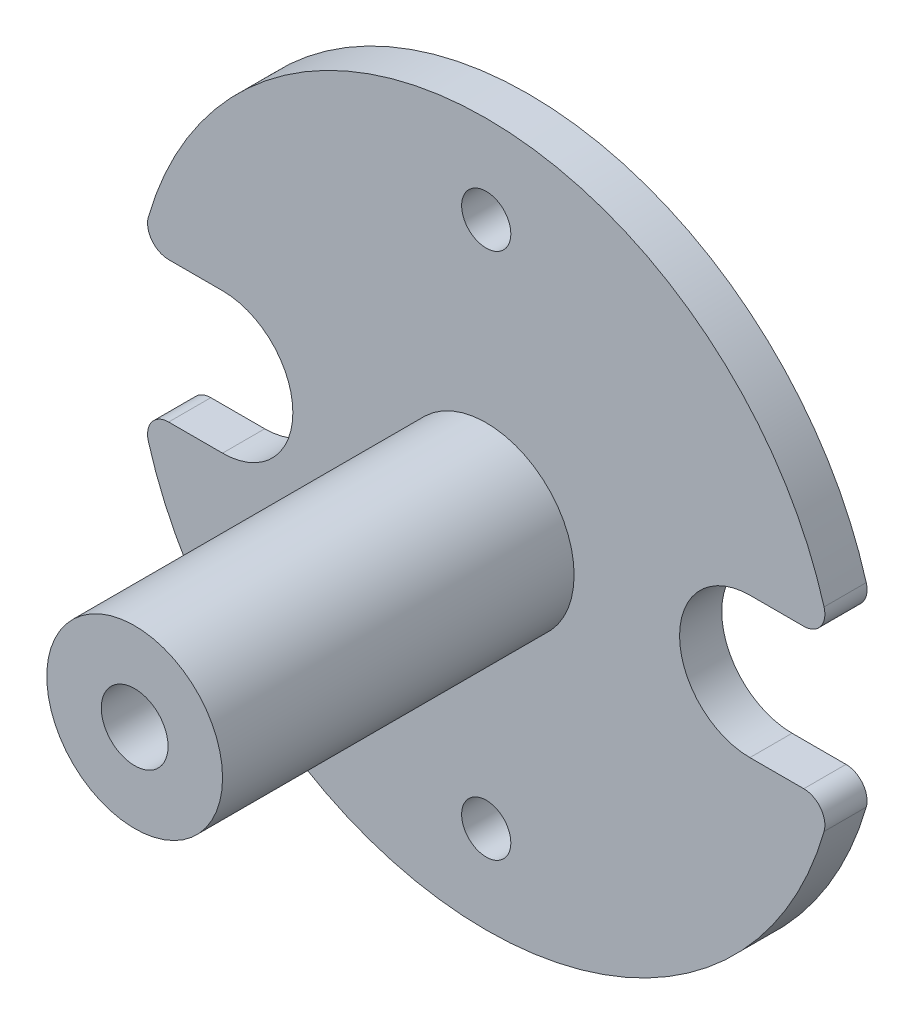
ISO-10303-21;
HEADER;
FILE_DESCRIPTION(('STEP AP214'),'2;1');
FILE_NAME('part.step','',(''),(''),'','','');
FILE_SCHEMA(('AUTOMOTIVE_DESIGN { 1 0 10303 214 1 1 1 1 }'));
ENDSEC;
DATA;
#1=APPLICATION_CONTEXT('core data for automotive mechanical design processes');
#2=APPLICATION_PROTOCOL_DEFINITION('international standard','automotive_design',2000,#1);
#3=PRODUCT_CONTEXT('',#1,'mechanical');
#4=PRODUCT('Part','Part','',(#3));
#5=PRODUCT_RELATED_PRODUCT_CATEGORY('part','',(#4));
#6=PRODUCT_DEFINITION_FORMATION('','',#4);
#7=PRODUCT_DEFINITION_CONTEXT('part definition',#1,'design');
#8=PRODUCT_DEFINITION('design','',#6,#7);
#9=PRODUCT_DEFINITION_SHAPE('','',#8);
#10=(LENGTH_UNIT() NAMED_UNIT(*) SI_UNIT(.MILLI.,.METRE.));
#11=(NAMED_UNIT(*) PLANE_ANGLE_UNIT() SI_UNIT($,.RADIAN.));
#12=(NAMED_UNIT(*) SI_UNIT($,.STERADIAN.) SOLID_ANGLE_UNIT());
#13=UNCERTAINTY_MEASURE_WITH_UNIT(LENGTH_MEASURE(1.E-05),#10,'distance_accuracy_value','');
#14=(GEOMETRIC_REPRESENTATION_CONTEXT(3) GLOBAL_UNCERTAINTY_ASSIGNED_CONTEXT((#13)) GLOBAL_UNIT_ASSIGNED_CONTEXT((#10,
#11,#12)) REPRESENTATION_CONTEXT('',''));
#15=CARTESIAN_POINT('',(0.,0.,0.));
#16=DIRECTION('',(0.,0.,1.));
#17=DIRECTION('',(1.,0.,0.));
#18=AXIS2_PLACEMENT_3D('',#15,#16,#17);
#19=CARTESIAN_POINT('',(-22.6983636363636,0.,-33.5049090909091));
#20=DIRECTION('',(0.,0.,-1.));
#21=DIRECTION('',(-1.,0.,0.));
#22=AXIS2_PLACEMENT_3D('',#19,#20,#21);
#23=PLANE('',#22);
#24=CARTESIAN_POINT('',(-22.6983636363636,-19.05,-33.5049090909091));
#25=DIRECTION('',(0.,0.,-1.));
#26=DIRECTION('',(-1.,0.,0.));
#27=AXIS2_PLACEMENT_3D('',#24,#25,#26);
#28=CIRCLE('',#27,1.778);
#29=CARTESIAN_POINT('',(-24.4763636363636,-19.05,-33.5049090909091));
#30=VERTEX_POINT('',#29);
#31=EDGE_CURVE('E171',#30,#30,#28,.T.);
#32=ORIENTED_EDGE('',*,*,#31,.F.);
#33=EDGE_LOOP('',(#32));
#34=FACE_BOUND('',#33,.T.);
#35=CARTESIAN_POINT('',(-22.6983636363636,19.05,-33.5049090909091));
#36=DIRECTION('',(0.,0.,-1.));
#37=DIRECTION('',(-1.,0.,0.));
#38=AXIS2_PLACEMENT_3D('',#35,#36,#37);
#39=CIRCLE('',#38,1.778);
#40=CARTESIAN_POINT('',(-24.4763636363636,19.05,-33.5049090909091));
#41=VERTEX_POINT('',#40);
#42=EDGE_CURVE('E188',#41,#41,#39,.T.);
#43=ORIENTED_EDGE('',*,*,#42,.F.);
#44=EDGE_LOOP('',(#43));
#45=FACE_BOUND('',#44,.T.);
#46=CARTESIAN_POINT('',(-22.6983636363636,0.,-33.5049090909091));
#47=DIRECTION('',(0.,0.,1.));
#48=DIRECTION('',(1.,0.,0.));
#49=AXIS2_PLACEMENT_3D('',#46,#47,#48);
#50=CIRCLE('',#49,25.4);
#51=CARTESIAN_POINT('',(1.71069003871374,7.0255319148938,-33.5049090909091));
#52=VERTEX_POINT('',#51);
#53=CARTESIAN_POINT('',(-47.1074173114411,7.02553191489362,-33.5049090909091));
#54=VERTEX_POINT('',#53);
#55=EDGE_CURVE('E209',#52,#54,#50,.T.);
#56=ORIENTED_EDGE('',*,*,#55,.F.);
#57=CARTESIAN_POINT('',(0.246146818209104,6.60400000000017,-33.5049090909091));
#58=DIRECTION('',(0.,0.,-1.));
#59=DIRECTION('',(-1.,0.,0.));
#60=AXIS2_PLACEMENT_3D('',#57,#58,#59);
#61=CIRCLE('',#60,1.524);
#62=CARTESIAN_POINT('',(0.246146818209114,5.08000000000017,-33.5049090909091));
#63=VERTEX_POINT('',#62);
#64=EDGE_CURVE('E249',#52,#63,#61,.T.);
#65=ORIENTED_EDGE('',*,*,#64,.T.);
#66=DIRECTION('',(1.,0.,0.));
#67=VECTOR('',#66,1.);
#68=CARTESIAN_POINT('',(-3.64836363636366,5.08000000000014,-33.5049090909091));
#69=LINE('',#68,#67);
#70=CARTESIAN_POINT('',(-3.64836363636367,5.08000000000014,-33.5049090909091));
#71=VERTEX_POINT('',#70);
#72=EDGE_CURVE('E178',#71,#63,#69,.T.);
#73=ORIENTED_EDGE('',*,*,#72,.F.);
#74=CARTESIAN_POINT('',(-3.64836363636363,1.37691343314675E-13,-33.5049090909091));
#75=DIRECTION('',(0.,0.,-1.));
#76=DIRECTION('',(-1.,0.,0.));
#77=AXIS2_PLACEMENT_3D('',#74,#75,#76);
#78=CIRCLE('',#77,5.08);
#79=CARTESIAN_POINT('',(-3.64836363636359,-5.07999999999987,-33.5049090909091));
#80=VERTEX_POINT('',#79);
#81=EDGE_CURVE('E174',#80,#71,#78,.T.);
#82=ORIENTED_EDGE('',*,*,#81,.F.);
#83=DIRECTION('',(1.,0.,0.));
#84=VECTOR('',#83,1.);
#85=CARTESIAN_POINT('',(-3.6483636363636,-5.07999999999987,-33.5049090909091));
#86=LINE('',#85,#84);
#87=CARTESIAN_POINT('',(0.246146818209187,-5.07999999999984,-33.5049090909091));
#88=VERTEX_POINT('',#87);
#89=EDGE_CURVE('E161',#80,#88,#86,.T.);
#90=ORIENTED_EDGE('',*,*,#89,.T.);
#91=CARTESIAN_POINT('',(0.246146818209197,-6.60399999999984,-33.5049090909091));
#92=DIRECTION('',(0.,0.,-1.));
#93=DIRECTION('',(-1.,0.,0.));
#94=AXIS2_PLACEMENT_3D('',#91,#92,#93);
#95=CIRCLE('',#94,1.524);
#96=CARTESIAN_POINT('',(1.71069003871385,-7.02553191489345,-33.5049090909091));
#97=VERTEX_POINT('',#96);
#98=EDGE_CURVE('E246',#88,#97,#95,.T.);
#99=ORIENTED_EDGE('',*,*,#98,.T.);
#100=CARTESIAN_POINT('',(-47.1074173114411,-7.02553191489362,-33.5049090909091));
#101=VERTEX_POINT('',#100);
#102=EDGE_CURVE('E206',#101,#97,#50,.T.);
#103=ORIENTED_EDGE('',*,*,#102,.F.);
#104=CARTESIAN_POINT('',(-45.6428740909364,-6.604,-33.5049090909091));
#105=DIRECTION('',(0.,0.,-1.));
#106=DIRECTION('',(-1.,0.,0.));
#107=AXIS2_PLACEMENT_3D('',#104,#105,#106);
#108=CIRCLE('',#107,1.524);
#109=CARTESIAN_POINT('',(-45.6428740909364,-5.08,-33.5049090909091));
#110=VERTEX_POINT('',#109);
#111=EDGE_CURVE('E156',#101,#110,#108,.T.);
#112=ORIENTED_EDGE('',*,*,#111,.T.);
#113=DIRECTION('',(-1.,0.,0.));
#114=VECTOR('',#113,1.);
#115=CARTESIAN_POINT('',(-41.7483636363636,-5.08,-33.5049090909091));
#116=LINE('',#115,#114);
#117=CARTESIAN_POINT('',(-41.7483636363636,-5.08,-33.5049090909091));
#118=VERTEX_POINT('',#117);
#119=EDGE_CURVE('E134',#118,#110,#116,.T.);
#120=ORIENTED_EDGE('',*,*,#119,.F.);
#121=CARTESIAN_POINT('',(-41.7483636363636,0.,-33.5049090909091));
#122=DIRECTION('',(0.,0.,-1.));
#123=DIRECTION('',(-1.,0.,0.));
#124=AXIS2_PLACEMENT_3D('',#121,#122,#123);
#125=CIRCLE('',#124,5.08);
#126=CARTESIAN_POINT('',(-41.7483636363636,5.08,-33.5049090909091));
#127=VERTEX_POINT('',#126);
#128=EDGE_CURVE('E146',#127,#118,#125,.T.);
#129=ORIENTED_EDGE('',*,*,#128,.F.);
#130=DIRECTION('',(-1.,0.,0.));
#131=VECTOR('',#130,1.);
#132=CARTESIAN_POINT('',(-41.7483636363636,5.08,-33.5049090909091));
#133=LINE('',#132,#131);
#134=CARTESIAN_POINT('',(-45.6428740909364,5.08,-33.5049090909091));
#135=VERTEX_POINT('',#134);
#136=EDGE_CURVE('E158',#127,#135,#133,.T.);
#137=ORIENTED_EDGE('',*,*,#136,.T.);
#138=CARTESIAN_POINT('',(-45.6428740909364,6.604,-33.5049090909091));
#139=DIRECTION('',(0.,0.,-1.));
#140=DIRECTION('',(-1.,0.,0.));
#141=AXIS2_PLACEMENT_3D('',#138,#139,#140);
#142=CIRCLE('',#141,1.524);
#143=EDGE_CURVE('E243',#135,#54,#142,.T.);
#144=ORIENTED_EDGE('',*,*,#143,.T.);
#145=EDGE_LOOP('',(#56,#65,#73,#82,#90,#99,#103,#112,#120,#129,#137,#144));
#146=FACE_BOUND('',#145,.T.);
#147=ADVANCED_FACE('F39',(#34,#45,#146),#23,.T.);
#148=CARTESIAN_POINT('',(-22.6983636363636,0.,-5.05690909090908));
#149=DIRECTION('',(0.,0.,1.));
#150=DIRECTION('',(1.,0.,0.));
#151=AXIS2_PLACEMENT_3D('',#148,#149,#150);
#152=CYLINDRICAL_SURFACE('',#151,25.4);
#153=CARTESIAN_POINT('',(-22.6983636363636,0.,-30.4569090909091));
#154=DIRECTION('',(0.,0.,1.));
#155=DIRECTION('',(1.,0.,0.));
#156=AXIS2_PLACEMENT_3D('',#153,#154,#155);
#157=CIRCLE('',#156,25.4);
#158=CARTESIAN_POINT('',(1.71069003871374,7.0255319148938,-30.4569090909091));
#159=VERTEX_POINT('',#158);
#160=CARTESIAN_POINT('',(-47.1074173114411,7.02553191489362,-30.4569090909091));
#161=VERTEX_POINT('',#160);
#162=EDGE_CURVE('E205',#159,#161,#157,.T.);
#163=ORIENTED_EDGE('',*,*,#162,.F.);
#164=DIRECTION('',(0.,0.,1.));
#165=VECTOR('',#164,1.);
#166=CARTESIAN_POINT('',(1.71069003871374,7.0255319148938,-5.05690909090908));
#167=LINE('',#166,#165);
#168=EDGE_CURVE('E237',#159,#52,#167,.F.);
#169=ORIENTED_EDGE('',*,*,#168,.T.);
#170=ORIENTED_EDGE('',*,*,#55,.T.);
#171=DIRECTION('',(0.,0.,1.));
#172=VECTOR('',#171,1.);
#173=CARTESIAN_POINT('',(-47.1074173114411,7.02553191489362,-5.05690909090908));
#174=LINE('',#173,#172);
#175=EDGE_CURVE('E234',#54,#161,#174,.T.);
#176=ORIENTED_EDGE('',*,*,#175,.T.);
#177=EDGE_LOOP('',(#163,#169,#170,#176));
#178=FACE_BOUND('',#177,.T.);
#179=ADVANCED_FACE('F287',(#178),#152,.T.);
#180=ORIENTED_EDGE('',*,*,#102,.T.);
#181=DIRECTION('',(0.,0.,1.));
#182=VECTOR('',#181,1.);
#183=CARTESIAN_POINT('',(1.71069003871385,-7.02553191489345,-5.05690909090908));
#184=LINE('',#183,#182);
#185=CARTESIAN_POINT('',(1.71069003871385,-7.02553191489345,-30.4569090909091));
#186=VERTEX_POINT('',#185);
#187=EDGE_CURVE('E63',#97,#186,#184,.T.);
#188=ORIENTED_EDGE('',*,*,#187,.T.);
#189=CARTESIAN_POINT('',(-47.1074173114411,-7.02553191489362,-30.4569090909091));
#190=VERTEX_POINT('',#189);
#191=EDGE_CURVE('E202',#190,#186,#157,.T.);
#192=ORIENTED_EDGE('',*,*,#191,.F.);
#193=DIRECTION('',(0.,0.,1.));
#194=VECTOR('',#193,1.);
#195=CARTESIAN_POINT('',(-47.1074173114411,-7.02553191489362,-5.05690909090908));
#196=LINE('',#195,#194);
#197=EDGE_CURVE('E270',#190,#101,#196,.F.);
#198=ORIENTED_EDGE('',*,*,#197,.T.);
#199=EDGE_LOOP('',(#180,#188,#192,#198));
#200=FACE_BOUND('',#199,.T.);
#201=ADVANCED_FACE('F328',(#200),#152,.T.);
#202=CARTESIAN_POINT('',(2.70163636363636,0.,-30.4569090909091));
#203=DIRECTION('',(0.,0.,1.));
#204=DIRECTION('',(1.,0.,0.));
#205=AXIS2_PLACEMENT_3D('',#202,#203,#204);
#206=PLANE('',#205);
#207=CARTESIAN_POINT('',(-22.6983636363636,-19.05,-30.4569090909091));
#208=DIRECTION('',(0.,0.,1.));
#209=DIRECTION('',(1.,0.,0.));
#210=AXIS2_PLACEMENT_3D('',#207,#208,#209);
#211=CIRCLE('',#210,1.778);
#212=CARTESIAN_POINT('',(-20.9203636363636,-19.05,-30.4569090909091));
#213=VERTEX_POINT('',#212);
#214=EDGE_CURVE('E198',#213,#213,#211,.T.);
#215=ORIENTED_EDGE('',*,*,#214,.F.);
#216=EDGE_LOOP('',(#215));
#217=FACE_BOUND('',#216,.T.);
#218=CARTESIAN_POINT('',(-22.6983636363636,19.05,-30.4569090909091));
#219=DIRECTION('',(0.,0.,1.));
#220=DIRECTION('',(1.,0.,0.));
#221=AXIS2_PLACEMENT_3D('',#218,#219,#220);
#222=CIRCLE('',#221,1.778);
#223=CARTESIAN_POINT('',(-20.9203636363636,19.05,-30.4569090909091));
#224=VERTEX_POINT('',#223);
#225=EDGE_CURVE('E142',#224,#224,#222,.T.);
#226=ORIENTED_EDGE('',*,*,#225,.F.);
#227=EDGE_LOOP('',(#226));
#228=FACE_BOUND('',#227,.T.);
#229=CARTESIAN_POINT('',(-22.6983636363636,0.,-30.4569090909091));
#230=DIRECTION('',(0.,0.,1.));
#231=DIRECTION('',(1.,0.,0.));
#232=AXIS2_PLACEMENT_3D('',#229,#230,#231);
#233=CIRCLE('',#232,6.35);
#234=CARTESIAN_POINT('',(-16.3483636363636,0.,-30.4569090909091));
#235=VERTEX_POINT('',#234);
#236=EDGE_CURVE('E197',#235,#235,#233,.T.);
#237=ORIENTED_EDGE('',*,*,#236,.F.);
#238=EDGE_LOOP('',(#237));
#239=FACE_BOUND('',#238,.T.);
#240=DIRECTION('',(-1.,0.,0.));
#241=VECTOR('',#240,1.);
#242=CARTESIAN_POINT('',(2.70163636363633,5.08000000000019,-30.4569090909091));
#243=LINE('',#242,#241);
#244=CARTESIAN_POINT('',(0.246146818209114,5.08000000000017,-30.4569090909091));
#245=VERTEX_POINT('',#244);
#246=CARTESIAN_POINT('',(-3.64836363636367,5.08000000000014,-30.4569090909091));
#247=VERTEX_POINT('',#246);
#248=EDGE_CURVE('E220',#245,#247,#243,.T.);
#249=ORIENTED_EDGE('',*,*,#248,.F.);
#250=CARTESIAN_POINT('',(0.246146818209104,6.60400000000017,-30.4569090909091));
#251=DIRECTION('',(0.,0.,1.));
#252=DIRECTION('',(1.,0.,0.));
#253=AXIS2_PLACEMENT_3D('',#250,#251,#252);
#254=CIRCLE('',#253,1.524);
#255=EDGE_CURVE('E263',#245,#159,#254,.T.);
#256=ORIENTED_EDGE('',*,*,#255,.T.);
#257=ORIENTED_EDGE('',*,*,#162,.T.);
#258=CARTESIAN_POINT('',(-45.6428740909364,6.604,-30.4569090909091));
#259=DIRECTION('',(0.,0.,1.));
#260=DIRECTION('',(1.,0.,0.));
#261=AXIS2_PLACEMENT_3D('',#258,#259,#260);
#262=CIRCLE('',#261,1.524);
#263=CARTESIAN_POINT('',(-45.6428740909364,5.08,-30.4569090909091));
#264=VERTEX_POINT('',#263);
#265=EDGE_CURVE('E258',#161,#264,#262,.T.);
#266=ORIENTED_EDGE('',*,*,#265,.T.);
#267=DIRECTION('',(1.,0.,0.));
#268=VECTOR('',#267,1.);
#269=CARTESIAN_POINT('',(2.70163636363636,5.08,-30.4569090909091));
#270=LINE('',#269,#268);
#271=CARTESIAN_POINT('',(-41.7483636363636,5.08,-30.4569090909091));
#272=VERTEX_POINT('',#271);
#273=EDGE_CURVE('E231',#264,#272,#270,.T.);
#274=ORIENTED_EDGE('',*,*,#273,.T.);
#275=CARTESIAN_POINT('',(-41.7483636363636,0.,-30.4569090909091));
#276=DIRECTION('',(0.,0.,1.));
#277=DIRECTION('',(1.,0.,0.));
#278=AXIS2_PLACEMENT_3D('',#275,#276,#277);
#279=CIRCLE('',#278,5.08);
#280=CARTESIAN_POINT('',(-41.7483636363636,-5.08,-30.4569090909091));
#281=VERTEX_POINT('',#280);
#282=EDGE_CURVE('E226',#281,#272,#279,.T.);
#283=ORIENTED_EDGE('',*,*,#282,.F.);
#284=DIRECTION('',(1.,0.,0.));
#285=VECTOR('',#284,1.);
#286=CARTESIAN_POINT('',(2.70163636363636,-5.08,-30.4569090909091));
#287=LINE('',#286,#285);
#288=CARTESIAN_POINT('',(-45.6428740909364,-5.08,-30.4569090909091));
#289=VERTEX_POINT('',#288);
#290=EDGE_CURVE('E137',#289,#281,#287,.T.);
#291=ORIENTED_EDGE('',*,*,#290,.F.);
#292=CARTESIAN_POINT('',(-45.6428740909364,-6.604,-30.4569090909091));
#293=DIRECTION('',(0.,0.,1.));
#294=DIRECTION('',(1.,0.,0.));
#295=AXIS2_PLACEMENT_3D('',#292,#293,#294);
#296=CIRCLE('',#295,1.524);
#297=EDGE_CURVE('E255',#289,#190,#296,.T.);
#298=ORIENTED_EDGE('',*,*,#297,.T.);
#299=ORIENTED_EDGE('',*,*,#191,.T.);
#300=CARTESIAN_POINT('',(0.246146818209197,-6.60399999999984,-30.4569090909091));
#301=DIRECTION('',(0.,0.,1.));
#302=DIRECTION('',(1.,0.,0.));
#303=AXIS2_PLACEMENT_3D('',#300,#301,#302);
#304=CIRCLE('',#303,1.524);
#305=CARTESIAN_POINT('',(0.246146818209187,-5.07999999999984,-30.4569090909091));
#306=VERTEX_POINT('',#305);
#307=EDGE_CURVE('E55',#186,#306,#304,.T.);
#308=ORIENTED_EDGE('',*,*,#307,.T.);
#309=DIRECTION('',(-1.,0.,0.));
#310=VECTOR('',#309,1.);
#311=CARTESIAN_POINT('',(2.7016363636364,-5.07999999999982,-30.4569090909091));
#312=LINE('',#311,#310);
#313=CARTESIAN_POINT('',(-3.64836363636359,-5.07999999999987,-30.4569090909091));
#314=VERTEX_POINT('',#313);
#315=EDGE_CURVE('E223',#306,#314,#312,.T.);
#316=ORIENTED_EDGE('',*,*,#315,.T.);
#317=CARTESIAN_POINT('',(-3.64836363636363,1.37691343314675E-13,-30.4569090909091));
#318=DIRECTION('',(0.,0.,1.));
#319=DIRECTION('',(1.,0.,0.));
#320=AXIS2_PLACEMENT_3D('',#317,#318,#319);
#321=CIRCLE('',#320,5.08);
#322=EDGE_CURVE('E216',#247,#314,#321,.T.);
#323=ORIENTED_EDGE('',*,*,#322,.F.);
#324=EDGE_LOOP('',(#249,#256,#257,#266,#274,#283,#291,#298,#299,#308,#316,#323));
#325=FACE_BOUND('',#324,.T.);
#326=ADVANCED_FACE('F293',(#217,#228,#239,#325),#206,.T.);
#327=CARTESIAN_POINT('',(-22.6983636363636,0.,-5.05690909090908));
#328=DIRECTION('',(0.,0.,1.));
#329=DIRECTION('',(1.,0.,0.));
#330=AXIS2_PLACEMENT_3D('',#327,#328,#329);
#331=CYLINDRICAL_SURFACE('',#330,6.35);
#332=ORIENTED_EDGE('',*,*,#236,.T.);
#333=EDGE_LOOP('',(#332));
#334=FACE_BOUND('',#333,.T.);
#335=CARTESIAN_POINT('',(-22.6983636363636,0.,-5.05690909090908));
#336=DIRECTION('',(0.,0.,1.));
#337=DIRECTION('',(1.,0.,0.));
#338=AXIS2_PLACEMENT_3D('',#335,#336,#337);
#339=CIRCLE('',#338,6.35);
#340=CARTESIAN_POINT('',(-16.3483636363636,0.,-5.05690909090908));
#341=VERTEX_POINT('',#340);
#342=EDGE_CURVE('E193',#341,#341,#339,.T.);
#343=ORIENTED_EDGE('',*,*,#342,.F.);
#344=EDGE_LOOP('',(#343));
#345=FACE_BOUND('',#344,.T.);
#346=ADVANCED_FACE('F335',(#334,#345),#331,.T.);
#347=CARTESIAN_POINT('',(-16.3483636363636,0.,-5.05690909090908));
#348=DIRECTION('',(0.,0.,1.));
#349=DIRECTION('',(1.,0.,0.));
#350=AXIS2_PLACEMENT_3D('',#347,#348,#349);
#351=PLANE('',#350);
#352=CARTESIAN_POINT('',(-22.6983636363636,0.,-5.05690909090908));
#353=DIRECTION('',(0.,0.,1.));
#354=DIRECTION('',(1.,0.,0.));
#355=AXIS2_PLACEMENT_3D('',#352,#353,#354);
#356=CIRCLE('',#355,2.413);
#357=CARTESIAN_POINT('',(-20.2853636363636,0.,-5.05690909090908));
#358=VERTEX_POINT('',#357);
#359=EDGE_CURVE('E375',#358,#358,#356,.T.);
#360=ORIENTED_EDGE('',*,*,#359,.F.);
#361=EDGE_LOOP('',(#360));
#362=FACE_BOUND('',#361,.T.);
#363=ORIENTED_EDGE('',*,*,#342,.T.);
#364=EDGE_LOOP('',(#363));
#365=FACE_BOUND('',#364,.T.);
#366=ADVANCED_FACE('F339',(#362,#365),#351,.T.);
#367=CARTESIAN_POINT('',(-22.6983636363636,19.05,-28.4249090909091));
#368=DIRECTION('',(0.,0.,-1.));
#369=DIRECTION('',(-1.,0.,0.));
#370=AXIS2_PLACEMENT_3D('',#367,#368,#369);
#371=CYLINDRICAL_SURFACE('',#370,1.778);
#372=ORIENTED_EDGE('',*,*,#225,.T.);
#373=EDGE_LOOP('',(#372));
#374=FACE_BOUND('',#373,.T.);
#375=ORIENTED_EDGE('',*,*,#42,.T.);
#376=EDGE_LOOP('',(#375));
#377=FACE_BOUND('',#376,.T.);
#378=ADVANCED_FACE('F343',(#374,#377),#371,.F.);
#379=CARTESIAN_POINT('',(-22.6983636363636,-19.05,-28.4249090909091));
#380=DIRECTION('',(0.,0.,-1.));
#381=DIRECTION('',(-1.,0.,0.));
#382=AXIS2_PLACEMENT_3D('',#379,#380,#381);
#383=CYLINDRICAL_SURFACE('',#382,1.778);
#384=ORIENTED_EDGE('',*,*,#214,.T.);
#385=EDGE_LOOP('',(#384));
#386=FACE_BOUND('',#385,.T.);
#387=ORIENTED_EDGE('',*,*,#31,.T.);
#388=EDGE_LOOP('',(#387));
#389=FACE_BOUND('',#388,.T.);
#390=ADVANCED_FACE('F347',(#386,#389),#383,.F.);
#391=CARTESIAN_POINT('',(-3.6483636363636,-5.07999999999987,-28.4249090909091));
#392=DIRECTION('',(0.,1.,0.));
#393=DIRECTION('',(-1.,0.,0.));
#394=AXIS2_PLACEMENT_3D('',#391,#392,#393);
#395=PLANE('',#394);
#396=ORIENTED_EDGE('',*,*,#315,.F.);
#397=DIRECTION('',(0.,0.,1.));
#398=VECTOR('',#397,1.);
#399=CARTESIAN_POINT('',(0.246146818209187,-5.07999999999984,-28.4249090909091));
#400=LINE('',#399,#398);
#401=EDGE_CURVE('E266',#306,#88,#400,.F.);
#402=ORIENTED_EDGE('',*,*,#401,.T.);
#403=ORIENTED_EDGE('',*,*,#89,.F.);
#404=DIRECTION('',(0.,0.,-1.));
#405=VECTOR('',#404,1.);
#406=CARTESIAN_POINT('',(-3.64836363636359,-5.07999999999987,-28.4249090909091));
#407=LINE('',#406,#405);
#408=EDGE_CURVE('E170',#314,#80,#407,.T.);
#409=ORIENTED_EDGE('',*,*,#408,.F.);
#410=EDGE_LOOP('',(#396,#402,#403,#409));
#411=FACE_BOUND('',#410,.T.);
#412=ADVANCED_FACE('F310',(#411),#395,.T.);
#413=CARTESIAN_POINT('',(-3.64836363636366,5.08000000000014,-28.4249090909091));
#414=DIRECTION('',(0.,1.,0.));
#415=DIRECTION('',(-1.,0.,0.));
#416=AXIS2_PLACEMENT_3D('',#413,#414,#415);
#417=PLANE('',#416);
#418=ORIENTED_EDGE('',*,*,#72,.T.);
#419=DIRECTION('',(0.,0.,-1.));
#420=VECTOR('',#419,1.);
#421=CARTESIAN_POINT('',(0.246146818209114,5.08000000000017,-30.4569090909091));
#422=LINE('',#421,#420);
#423=EDGE_CURVE('E252',#63,#245,#422,.F.);
#424=ORIENTED_EDGE('',*,*,#423,.T.);
#425=ORIENTED_EDGE('',*,*,#248,.T.);
#426=DIRECTION('',(0.,0.,-1.));
#427=VECTOR('',#426,1.);
#428=CARTESIAN_POINT('',(-3.64836363636367,5.08000000000014,-28.4249090909091));
#429=LINE('',#428,#427);
#430=EDGE_CURVE('E167',#247,#71,#429,.T.);
#431=ORIENTED_EDGE('',*,*,#430,.T.);
#432=EDGE_LOOP('',(#418,#424,#425,#431));
#433=FACE_BOUND('',#432,.T.);
#434=ADVANCED_FACE('F302',(#433),#417,.F.);
#435=CARTESIAN_POINT('',(-3.64836363636363,1.37691343314675E-13,-28.4249090909091));
#436=DIRECTION('',(0.,0.,-1.));
#437=DIRECTION('',(-1.,0.,0.));
#438=AXIS2_PLACEMENT_3D('',#435,#436,#437);
#439=CYLINDRICAL_SURFACE('',#438,5.08);
#440=ORIENTED_EDGE('',*,*,#322,.T.);
#441=ORIENTED_EDGE('',*,*,#408,.T.);
#442=ORIENTED_EDGE('',*,*,#81,.T.);
#443=ORIENTED_EDGE('',*,*,#430,.F.);
#444=EDGE_LOOP('',(#440,#441,#442,#443));
#445=FACE_BOUND('',#444,.T.);
#446=ADVANCED_FACE('F306',(#445),#439,.F.);
#447=CARTESIAN_POINT('',(-41.7483636363636,5.08,-28.4249090909091));
#448=DIRECTION('',(0.,-1.,0.));
#449=DIRECTION('',(0.,0.,-1.));
#450=AXIS2_PLACEMENT_3D('',#447,#448,#449);
#451=PLANE('',#450);
#452=ORIENTED_EDGE('',*,*,#273,.F.);
#453=DIRECTION('',(0.,0.,1.));
#454=VECTOR('',#453,1.);
#455=CARTESIAN_POINT('',(-45.6428740909364,5.08,-28.4249090909091));
#456=LINE('',#455,#454);
#457=EDGE_CURVE('E48',#264,#135,#456,.F.);
#458=ORIENTED_EDGE('',*,*,#457,.T.);
#459=ORIENTED_EDGE('',*,*,#136,.F.);
#460=DIRECTION('',(0.,0.,-1.));
#461=VECTOR('',#460,1.);
#462=CARTESIAN_POINT('',(-41.7483636363636,5.08,-28.4249090909091));
#463=LINE('',#462,#461);
#464=EDGE_CURVE('E143',#272,#127,#463,.T.);
#465=ORIENTED_EDGE('',*,*,#464,.F.);
#466=EDGE_LOOP('',(#452,#458,#459,#465));
#467=FACE_BOUND('',#466,.T.);
#468=ADVANCED_FACE('F280',(#467),#451,.T.);
#469=CARTESIAN_POINT('',(-41.7483636363636,-5.08,-28.4249090909091));
#470=DIRECTION('',(0.,-1.,0.));
#471=DIRECTION('',(0.,0.,-1.));
#472=AXIS2_PLACEMENT_3D('',#469,#470,#471);
#473=PLANE('',#472);
#474=ORIENTED_EDGE('',*,*,#119,.T.);
#475=DIRECTION('',(0.,0.,-1.));
#476=VECTOR('',#475,1.);
#477=CARTESIAN_POINT('',(-45.6428740909364,-5.08,-30.4569090909091));
#478=LINE('',#477,#476);
#479=EDGE_CURVE('E11',#110,#289,#478,.F.);
#480=ORIENTED_EDGE('',*,*,#479,.T.);
#481=ORIENTED_EDGE('',*,*,#290,.T.);
#482=DIRECTION('',(0.,0.,-1.));
#483=VECTOR('',#482,1.);
#484=CARTESIAN_POINT('',(-41.7483636363636,-5.08,-28.4249090909091));
#485=LINE('',#484,#483);
#486=EDGE_CURVE('E130',#281,#118,#485,.T.);
#487=ORIENTED_EDGE('',*,*,#486,.T.);
#488=EDGE_LOOP('',(#474,#480,#481,#487));
#489=FACE_BOUND('',#488,.T.);
#490=ADVANCED_FACE('F132',(#489),#473,.F.);
#491=CARTESIAN_POINT('',(-41.7483636363636,0.,-28.4249090909091));
#492=DIRECTION('',(0.,0.,-1.));
#493=DIRECTION('',(-1.,0.,0.));
#494=AXIS2_PLACEMENT_3D('',#491,#492,#493);
#495=CYLINDRICAL_SURFACE('',#494,5.08);
#496=ORIENTED_EDGE('',*,*,#282,.T.);
#497=ORIENTED_EDGE('',*,*,#464,.T.);
#498=ORIENTED_EDGE('',*,*,#128,.T.);
#499=ORIENTED_EDGE('',*,*,#486,.F.);
#500=EDGE_LOOP('',(#496,#497,#498,#499));
#501=FACE_BOUND('',#500,.T.);
#502=ADVANCED_FACE('F147',(#501),#495,.F.);
#503=CARTESIAN_POINT('',(-22.6983636363636,0.,-24.1069090909091));
#504=DIRECTION('',(0.,0.,1.));
#505=DIRECTION('',(1.,0.,0.));
#506=AXIS2_PLACEMENT_3D('',#503,#504,#505);
#507=CYLINDRICAL_SURFACE('',#506,2.413);
#508=CARTESIAN_POINT('',(-22.6983636363636,0.,-24.1069090909091));
#509=DIRECTION('',(0.,0.,1.));
#510=DIRECTION('',(1.,0.,0.));
#511=AXIS2_PLACEMENT_3D('',#508,#509,#510);
#512=CIRCLE('',#511,2.413);
#513=CARTESIAN_POINT('',(-20.2853636363636,0.,-24.1069090909091));
#514=VERTEX_POINT('',#513);
#515=EDGE_CURVE('E192',#514,#514,#512,.T.);
#516=CARTESIAN_POINT('',(-20.2853636363636,0.,-24.1069090909091));
#517=CARTESIAN_POINT('',(-20.2853636363636,0.,-23.9084715909091));
#518=CARTESIAN_POINT('',(-20.2853636363636,0.,-23.7100340909091));
#519=CARTESIAN_POINT('',(-20.2853636363636,0.,-23.3131590909091));
#520=CARTESIAN_POINT('',(-20.2853636363636,0.,-23.1147215909091));
#521=CARTESIAN_POINT('',(-20.2853636363636,0.,-22.7178465909091));
#522=CARTESIAN_POINT('',(-20.2853636363636,0.,-22.5194090909091));
#523=CARTESIAN_POINT('',(-20.2853636363636,0.,-22.1225340909091));
#524=CARTESIAN_POINT('',(-20.2853636363636,0.,-21.9240965909091));
#525=CARTESIAN_POINT('',(-20.2853636363636,0.,-21.5272215909091));
#526=CARTESIAN_POINT('',(-20.2853636363636,0.,-21.3287840909091));
#527=CARTESIAN_POINT('',(-20.2853636363636,0.,-20.9319090909091));
#528=CARTESIAN_POINT('',(-20.2853636363636,0.,-20.7334715909091));
#529=CARTESIAN_POINT('',(-20.2853636363636,0.,-20.3365965909091));
#530=CARTESIAN_POINT('',(-20.2853636363636,0.,-20.1381590909091));
#531=CARTESIAN_POINT('',(-20.2853636363636,0.,-19.7412840909091));
#532=CARTESIAN_POINT('',(-20.2853636363636,0.,-19.5428465909091));
#533=CARTESIAN_POINT('',(-20.2853636363636,0.,-19.1459715909091));
#534=CARTESIAN_POINT('',(-20.2853636363636,0.,-18.9475340909091));
#535=CARTESIAN_POINT('',(-20.2853636363636,0.,-18.5506590909091));
#536=CARTESIAN_POINT('',(-20.2853636363636,0.,-18.3522215909091));
#537=CARTESIAN_POINT('',(-20.2853636363636,0.,-17.9553465909091));
#538=CARTESIAN_POINT('',(-20.2853636363636,0.,-17.7569090909091));
#539=CARTESIAN_POINT('',(-20.2853636363636,0.,-17.3600340909091));
#540=CARTESIAN_POINT('',(-20.2853636363636,0.,-17.1615965909091));
#541=CARTESIAN_POINT('',(-20.2853636363636,0.,-16.7647215909091));
#542=CARTESIAN_POINT('',(-20.2853636363636,0.,-16.5662840909091));
#543=CARTESIAN_POINT('',(-20.2853636363636,0.,-16.1694090909091));
#544=CARTESIAN_POINT('',(-20.2853636363636,0.,-15.9709715909091));
#545=CARTESIAN_POINT('',(-20.2853636363636,0.,-15.5740965909091));
#546=CARTESIAN_POINT('',(-20.2853636363636,0.,-15.3756590909091));
#547=CARTESIAN_POINT('',(-20.2853636363636,0.,-14.9787840909091));
#548=CARTESIAN_POINT('',(-20.2853636363636,0.,-14.7803465909091));
#549=CARTESIAN_POINT('',(-20.2853636363636,0.,-14.3834715909091));
#550=CARTESIAN_POINT('',(-20.2853636363636,0.,-14.1850340909091));
#551=CARTESIAN_POINT('',(-20.2853636363636,0.,-13.7881590909091));
#552=CARTESIAN_POINT('',(-20.2853636363636,0.,-13.5897215909091));
#553=CARTESIAN_POINT('',(-20.2853636363636,0.,-13.1928465909091));
#554=CARTESIAN_POINT('',(-20.2853636363636,0.,-12.9944090909091));
#555=CARTESIAN_POINT('',(-20.2853636363636,0.,-12.5975340909091));
#556=CARTESIAN_POINT('',(-20.2853636363636,0.,-12.3990965909091));
#557=CARTESIAN_POINT('',(-20.2853636363636,0.,-12.0022215909091));
#558=CARTESIAN_POINT('',(-20.2853636363636,0.,-11.8037840909091));
#559=CARTESIAN_POINT('',(-20.2853636363636,0.,-11.4069090909091));
#560=CARTESIAN_POINT('',(-20.2853636363636,0.,-11.2084715909091));
#561=CARTESIAN_POINT('',(-20.2853636363636,0.,-10.8115965909091));
#562=CARTESIAN_POINT('',(-20.2853636363636,0.,-10.6131590909091));
#563=CARTESIAN_POINT('',(-20.2853636363636,0.,-10.2162840909091));
#564=CARTESIAN_POINT('',(-20.2853636363636,0.,-10.0178465909091));
#565=CARTESIAN_POINT('',(-20.2853636363636,0.,-9.62097159090908));
#566=CARTESIAN_POINT('',(-20.2853636363636,0.,-9.42253409090909));
#567=CARTESIAN_POINT('',(-20.2853636363636,0.,-9.02565909090908));
#568=CARTESIAN_POINT('',(-20.2853636363636,0.,-8.82722159090908));
#569=CARTESIAN_POINT('',(-20.2853636363636,0.,-8.43034659090909));
#570=CARTESIAN_POINT('',(-20.2853636363636,0.,-8.23190909090908));
#571=CARTESIAN_POINT('',(-20.2853636363636,0.,-7.83503409090908));
#572=CARTESIAN_POINT('',(-20.2853636363636,0.,-7.63659659090909));
#573=CARTESIAN_POINT('',(-20.2853636363636,0.,-7.23972159090909));
#574=CARTESIAN_POINT('',(-20.2853636363636,0.,-7.04128409090908));
#575=CARTESIAN_POINT('',(-20.2853636363636,0.,-6.64440909090909));
#576=CARTESIAN_POINT('',(-20.2853636363636,0.,-6.44597159090908));
#577=CARTESIAN_POINT('',(-20.2853636363636,0.,-6.04909659090908));
#578=CARTESIAN_POINT('',(-20.2853636363636,0.,-5.85065909090908));
#579=CARTESIAN_POINT('',(-20.2853636363636,0.,-5.45378409090908));
#580=CARTESIAN_POINT('',(-20.2853636363636,0.,-5.25534659090908));
#581=CARTESIAN_POINT('',(-20.2853636363636,0.,-5.05690909090908));
#582=B_SPLINE_CURVE_WITH_KNOTS('',3,(#516,#517,#518,#519,#520,#521,#522,#523,#524,#525,#526,
#527,#528,#529,#530,#531,#532,#533,#534,#535,#536,#537,#538,#539,#540,#541,#542,#543,#544,#545,
#546,#547,#548,#549,#550,#551,#552,#553,#554,#555,#556,#557,#558,#559,#560,#561,#562,#563,#564,
#565,#566,#567,#568,#569,#570,#571,#572,#573,#574,#575,#576,#577,#578,#579,#580,#581),
.UNSPECIFIED.,.F.,.F.,(4,2,2,2,2,2,2,2,2,2,2,2,2,2,2,2,2,2,2,2,2,2,2,2,2,2,2,2,2,2,2,2,4),(0.,
0.595312499999997,1.190625,1.7859375,2.38125,2.9765625,3.571875,4.1671875,4.7625,5.3578125,
5.953125,6.5484375,7.14375,7.7390625,8.334375,8.9296875,9.525,10.1203125,10.715625,11.3109375,
11.90625,12.5015625,13.096875,13.6921875,14.2875,14.8828125,15.478125,16.0734375,16.66875,
17.2640625,17.859375,18.4546875,19.05),.UNSPECIFIED.);
#583=EDGE_CURVE('BSEAM364',#514,#358,#582,.T.);
#584=ORIENTED_EDGE('',*,*,#515,.F.);
#585=ORIENTED_EDGE('',*,*,#359,.T.);
#586=ORIENTED_EDGE('',*,*,#583,.T.);
#587=ORIENTED_EDGE('',*,*,#583,.F.);
#588=EDGE_LOOP('',(#584,#586,#585,#587));
#589=FACE_BOUND('',#588,.T.);
#590=ADVANCED_FACE('F364',(#589),#507,.F.);
#591=CARTESIAN_POINT('',(-22.6983636363636,0.,-24.1069090909091));
#592=DIRECTION('',(0.,0.,1.));
#593=DIRECTION('',(1.,0.,0.));
#594=AXIS2_PLACEMENT_3D('',#591,#592,#593);
#595=PLANE('',#594);
#596=ORIENTED_EDGE('',*,*,#515,.T.);
#597=EDGE_LOOP('',(#596));
#598=FACE_BOUND('',#597,.T.);
#599=ADVANCED_FACE('F320',(#598),#595,.T.);
#600=CARTESIAN_POINT('',(0.246146818209104,6.60400000000017,-5.05690909090908));
#601=DIRECTION('',(0.,0.,1.));
#602=DIRECTION('',(1.,0.,0.));
#603=AXIS2_PLACEMENT_3D('',#600,#601,#602);
#604=CYLINDRICAL_SURFACE('',#603,1.524);
#605=ORIENTED_EDGE('',*,*,#255,.F.);
#606=ORIENTED_EDGE('',*,*,#423,.F.);
#607=ORIENTED_EDGE('',*,*,#64,.F.);
#608=ORIENTED_EDGE('',*,*,#168,.F.);
#609=EDGE_LOOP('',(#605,#606,#607,#608));
#610=FACE_BOUND('',#609,.T.);
#611=ADVANCED_FACE('F297',(#610),#604,.T.);
#612=CARTESIAN_POINT('',(0.246146818209197,-6.60399999999984,-5.05690909090908));
#613=DIRECTION('',(0.,0.,1.));
#614=DIRECTION('',(1.,0.,0.));
#615=AXIS2_PLACEMENT_3D('',#612,#613,#614);
#616=CYLINDRICAL_SURFACE('',#615,1.524);
#617=ORIENTED_EDGE('',*,*,#307,.F.);
#618=ORIENTED_EDGE('',*,*,#187,.F.);
#619=ORIENTED_EDGE('',*,*,#98,.F.);
#620=ORIENTED_EDGE('',*,*,#401,.F.);
#621=EDGE_LOOP('',(#617,#618,#619,#620));
#622=FACE_BOUND('',#621,.T.);
#623=ADVANCED_FACE('F313',(#622),#616,.T.);
#624=CARTESIAN_POINT('',(-45.6428740909364,6.604,-5.05690909090908));
#625=DIRECTION('',(0.,0.,1.));
#626=DIRECTION('',(1.,0.,0.));
#627=AXIS2_PLACEMENT_3D('',#624,#625,#626);
#628=CYLINDRICAL_SURFACE('',#627,1.524);
#629=ORIENTED_EDGE('',*,*,#265,.F.);
#630=ORIENTED_EDGE('',*,*,#175,.F.);
#631=ORIENTED_EDGE('',*,*,#143,.F.);
#632=ORIENTED_EDGE('',*,*,#457,.F.);
#633=EDGE_LOOP('',(#629,#630,#631,#632));
#634=FACE_BOUND('',#633,.T.);
#635=ADVANCED_FACE('F291',(#634),#628,.T.);
#636=CARTESIAN_POINT('',(-45.6428740909364,-6.604,-5.05690909090908));
#637=DIRECTION('',(0.,0.,1.));
#638=DIRECTION('',(1.,0.,0.));
#639=AXIS2_PLACEMENT_3D('',#636,#637,#638);
#640=CYLINDRICAL_SURFACE('',#639,1.524);
#641=ORIENTED_EDGE('',*,*,#297,.F.);
#642=ORIENTED_EDGE('',*,*,#479,.F.);
#643=ORIENTED_EDGE('',*,*,#111,.F.);
#644=ORIENTED_EDGE('',*,*,#197,.F.);
#645=EDGE_LOOP('',(#641,#642,#643,#644));
#646=FACE_BOUND('',#645,.T.);
#647=ADVANCED_FACE('F41',(#646),#640,.T.);
#648=CLOSED_SHELL('',(#147,#179,#201,#326,#346,#366,#378,#390,#412,#434,#446,#468,#490,#502,
#590,#599,#611,#623,#635,#647));
#649=MANIFOLD_SOLID_BREP('B2',#648);
#650=ADVANCED_BREP_SHAPE_REPRESENTATION('',(#18,#649),#14);
#651=SHAPE_DEFINITION_REPRESENTATION(#9,#650);
ENDSEC;
END-ISO-10303-21;
